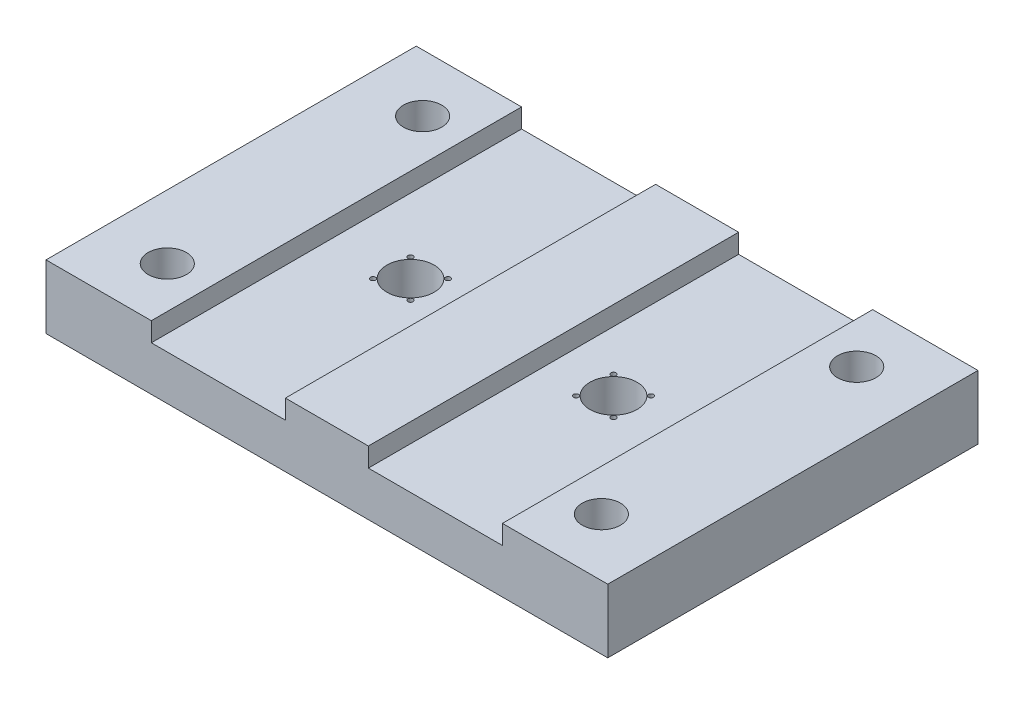
ISO-10303-21;
HEADER;
FILE_DESCRIPTION(('STEP AP214'),'2;1');
FILE_NAME('part.step','',(''),(''),'','','');
FILE_SCHEMA(('AUTOMOTIVE_DESIGN { 1 0 10303 214 1 1 1 1 }'));
ENDSEC;
DATA;
#1=APPLICATION_CONTEXT('core data for automotive mechanical design processes');
#2=APPLICATION_PROTOCOL_DEFINITION('international standard','automotive_design',2000,#1);
#3=PRODUCT_CONTEXT('',#1,'mechanical');
#4=PRODUCT('Part','Part','',(#3));
#5=PRODUCT_RELATED_PRODUCT_CATEGORY('part','',(#4));
#6=PRODUCT_DEFINITION_FORMATION('','',#4);
#7=PRODUCT_DEFINITION_CONTEXT('part definition',#1,'design');
#8=PRODUCT_DEFINITION('design','',#6,#7);
#9=PRODUCT_DEFINITION_SHAPE('','',#8);
#10=(LENGTH_UNIT() NAMED_UNIT(*) SI_UNIT(.MILLI.,.METRE.));
#11=(NAMED_UNIT(*) PLANE_ANGLE_UNIT() SI_UNIT($,.RADIAN.));
#12=(NAMED_UNIT(*) SI_UNIT($,.STERADIAN.) SOLID_ANGLE_UNIT());
#13=UNCERTAINTY_MEASURE_WITH_UNIT(LENGTH_MEASURE(1.E-05),#10,'distance_accuracy_value','');
#14=(GEOMETRIC_REPRESENTATION_CONTEXT(3) GLOBAL_UNCERTAINTY_ASSIGNED_CONTEXT((#13)) GLOBAL_UNIT_ASSIGNED_CONTEXT((#10,
#11,#12)) REPRESENTATION_CONTEXT('',''));
#15=CARTESIAN_POINT('',(0.,0.,0.));
#16=DIRECTION('',(0.,0.,1.));
#17=DIRECTION('',(1.,0.,0.));
#18=AXIS2_PLACEMENT_3D('',#15,#16,#17);
#19=CARTESIAN_POINT('',(340.,-171.,-200.));
#20=DIRECTION('',(0.,1.,0.));
#21=DIRECTION('',(0.,0.,1.));
#22=AXIS2_PLACEMENT_3D('',#19,#20,#21);
#23=CYLINDRICAL_SURFACE('',#22,30.);
#24=CARTESIAN_POINT('',(340.,100.,-200.));
#25=DIRECTION('',(0.,1.,0.));
#26=DIRECTION('',(0.,0.,1.));
#27=AXIS2_PLACEMENT_3D('',#24,#25,#26);
#28=CIRCLE('',#27,30.);
#29=CARTESIAN_POINT('',(340.,100.,-170.));
#30=VERTEX_POINT('',#29);
#31=EDGE_CURVE('E267',#30,#30,#28,.T.);
#32=ORIENTED_EDGE('',*,*,#31,.T.);
#33=EDGE_LOOP('',(#32));
#34=FACE_BOUND('',#33,.T.);
#35=CARTESIAN_POINT('',(340.,10.,-200.));
#36=DIRECTION('',(0.,-1.,0.));
#37=DIRECTION('',(0.,0.,-1.));
#38=AXIS2_PLACEMENT_3D('',#35,#36,#37);
#39=CIRCLE('',#38,30.);
#40=CARTESIAN_POINT('',(340.,10.,-230.));
#41=VERTEX_POINT('',#40);
#42=EDGE_CURVE('E233',#41,#41,#39,.F.);
#43=ORIENTED_EDGE('',*,*,#42,.F.);
#44=EDGE_LOOP('',(#43));
#45=FACE_BOUND('',#44,.T.);
#46=ADVANCED_FACE('F34',(#34,#45),#23,.F.);
#47=CARTESIAN_POINT('',(-340.,-171.,-200.));
#48=DIRECTION('',(0.,1.,0.));
#49=DIRECTION('',(0.,0.,1.));
#50=AXIS2_PLACEMENT_3D('',#47,#48,#49);
#51=CYLINDRICAL_SURFACE('',#50,30.);
#52=CARTESIAN_POINT('',(-340.,100.,-200.));
#53=DIRECTION('',(0.,1.,0.));
#54=DIRECTION('',(0.,0.,1.));
#55=AXIS2_PLACEMENT_3D('',#52,#53,#54);
#56=CIRCLE('',#55,30.);
#57=CARTESIAN_POINT('',(-340.,100.,-170.));
#58=VERTEX_POINT('',#57);
#59=EDGE_CURVE('E270',#58,#58,#56,.T.);
#60=ORIENTED_EDGE('',*,*,#59,.T.);
#61=EDGE_LOOP('',(#60));
#62=FACE_BOUND('',#61,.T.);
#63=CARTESIAN_POINT('',(-340.,10.,-200.));
#64=DIRECTION('',(0.,-1.,0.));
#65=DIRECTION('',(0.,0.,-1.));
#66=AXIS2_PLACEMENT_3D('',#63,#64,#65);
#67=CIRCLE('',#66,30.);
#68=CARTESIAN_POINT('',(-340.,10.,-230.));
#69=VERTEX_POINT('',#68);
#70=EDGE_CURVE('E229',#69,#69,#67,.F.);
#71=ORIENTED_EDGE('',*,*,#70,.F.);
#72=EDGE_LOOP('',(#71));
#73=FACE_BOUND('',#72,.T.);
#74=ADVANCED_FACE('F336',(#62,#73),#51,.F.);
#75=CARTESIAN_POINT('',(340.,-171.,200.));
#76=DIRECTION('',(0.,1.,0.));
#77=DIRECTION('',(0.,0.,1.));
#78=AXIS2_PLACEMENT_3D('',#75,#76,#77);
#79=CYLINDRICAL_SURFACE('',#78,30.);
#80=CARTESIAN_POINT('',(340.,100.,200.));
#81=DIRECTION('',(0.,1.,0.));
#82=DIRECTION('',(0.,0.,-1.));
#83=AXIS2_PLACEMENT_3D('',#80,#81,#82);
#84=CIRCLE('',#83,30.);
#85=CARTESIAN_POINT('',(340.,100.,170.));
#86=VERTEX_POINT('',#85);
#87=EDGE_CURVE('E264',#86,#86,#84,.T.);
#88=ORIENTED_EDGE('',*,*,#87,.T.);
#89=EDGE_LOOP('',(#88));
#90=FACE_BOUND('',#89,.T.);
#91=CARTESIAN_POINT('',(340.,10.,200.));
#92=DIRECTION('',(0.,-1.,0.));
#93=DIRECTION('',(0.,0.,-1.));
#94=AXIS2_PLACEMENT_3D('',#91,#92,#93);
#95=CIRCLE('',#94,30.);
#96=CARTESIAN_POINT('',(340.,10.,170.));
#97=VERTEX_POINT('',#96);
#98=EDGE_CURVE('E224',#97,#97,#95,.F.);
#99=ORIENTED_EDGE('',*,*,#98,.F.);
#100=EDGE_LOOP('',(#99));
#101=FACE_BOUND('',#100,.T.);
#102=ADVANCED_FACE('F342',(#90,#101),#79,.F.);
#103=CARTESIAN_POINT('',(-340.,-171.,200.));
#104=DIRECTION('',(0.,1.,0.));
#105=DIRECTION('',(0.,0.,1.));
#106=AXIS2_PLACEMENT_3D('',#103,#104,#105);
#107=CYLINDRICAL_SURFACE('',#106,30.);
#108=CARTESIAN_POINT('',(-340.,100.,200.));
#109=DIRECTION('',(0.,1.,0.));
#110=DIRECTION('',(0.,0.,-1.));
#111=AXIS2_PLACEMENT_3D('',#108,#109,#110);
#112=CIRCLE('',#111,30.);
#113=CARTESIAN_POINT('',(-340.,100.,170.));
#114=VERTEX_POINT('',#113);
#115=EDGE_CURVE('E222',#114,#114,#112,.T.);
#116=ORIENTED_EDGE('',*,*,#115,.T.);
#117=EDGE_LOOP('',(#116));
#118=FACE_BOUND('',#117,.T.);
#119=CARTESIAN_POINT('',(-340.,10.,200.));
#120=DIRECTION('',(0.,-1.,0.));
#121=DIRECTION('',(0.,0.,-1.));
#122=AXIS2_PLACEMENT_3D('',#119,#120,#121);
#123=CIRCLE('',#122,30.);
#124=CARTESIAN_POINT('',(-340.,10.,170.));
#125=VERTEX_POINT('',#124);
#126=EDGE_CURVE('E219',#125,#125,#123,.F.);
#127=ORIENTED_EDGE('',*,*,#126,.F.);
#128=EDGE_LOOP('',(#127));
#129=FACE_BOUND('',#128,.T.);
#130=ADVANCED_FACE('F332',(#118,#129),#107,.F.);
#131=CARTESIAN_POINT('',(0.,100.,0.));
#132=DIRECTION('',(0.,1.,0.));
#133=DIRECTION('',(0.,0.,1.));
#134=AXIS2_PLACEMENT_3D('',#131,#132,#133);
#135=PLANE('',#134);
#136=ORIENTED_EDGE('',*,*,#115,.F.);
#137=EDGE_LOOP('',(#136));
#138=FACE_BOUND('',#137,.T.);
#139=ORIENTED_EDGE('',*,*,#59,.F.);
#140=EDGE_LOOP('',(#139));
#141=FACE_BOUND('',#140,.T.);
#142=DIRECTION('',(0.,0.,1.));
#143=VECTOR('',#142,1.);
#144=CARTESIAN_POINT('',(-275.,100.,290.));
#145=LINE('',#144,#143);
#146=CARTESIAN_POINT('',(-275.,100.,-290.));
#147=VERTEX_POINT('',#146);
#148=CARTESIAN_POINT('',(-275.,100.,290.));
#149=VERTEX_POINT('',#148);
#150=EDGE_CURVE('E155',#147,#149,#145,.T.);
#151=ORIENTED_EDGE('',*,*,#150,.F.);
#152=DIRECTION('',(-1.,0.,0.));
#153=VECTOR('',#152,1.);
#154=CARTESIAN_POINT('',(-440.,100.,-290.));
#155=LINE('',#154,#153);
#156=CARTESIAN_POINT('',(-440.,100.,-290.));
#157=VERTEX_POINT('',#156);
#158=EDGE_CURVE('E160',#147,#157,#155,.T.);
#159=ORIENTED_EDGE('',*,*,#158,.T.);
#160=DIRECTION('',(0.,0.,1.));
#161=VECTOR('',#160,1.);
#162=CARTESIAN_POINT('',(-440.,100.,-290.));
#163=LINE('',#162,#161);
#164=CARTESIAN_POINT('',(-440.,100.,290.));
#165=VERTEX_POINT('',#164);
#166=EDGE_CURVE('E201',#157,#165,#163,.T.);
#167=ORIENTED_EDGE('',*,*,#166,.T.);
#168=DIRECTION('',(1.,0.,0.));
#169=VECTOR('',#168,1.);
#170=CARTESIAN_POINT('',(-440.,100.,290.));
#171=LINE('',#170,#169);
#172=EDGE_CURVE('E204',#165,#149,#171,.T.);
#173=ORIENTED_EDGE('',*,*,#172,.T.);
#174=EDGE_LOOP('',(#151,#159,#167,#173));
#175=FACE_BOUND('',#174,.T.);
#176=ADVANCED_FACE('F288',(#138,#141,#175),#135,.T.);
#177=DIRECTION('',(0.,0.,-1.));
#178=VECTOR('',#177,1.);
#179=CARTESIAN_POINT('',(-65.,100.,-290.));
#180=LINE('',#179,#178);
#181=CARTESIAN_POINT('',(-65.,100.,290.));
#182=VERTEX_POINT('',#181);
#183=CARTESIAN_POINT('',(-65.,100.,-290.));
#184=VERTEX_POINT('',#183);
#185=EDGE_CURVE('E173',#182,#184,#180,.T.);
#186=ORIENTED_EDGE('',*,*,#185,.F.);
#187=CARTESIAN_POINT('',(64.9999999999997,100.,290.));
#188=VERTEX_POINT('',#187);
#189=EDGE_CURVE('E208',#182,#188,#171,.T.);
#190=ORIENTED_EDGE('',*,*,#189,.T.);
#191=DIRECTION('',(0.,0.,1.));
#192=VECTOR('',#191,1.);
#193=CARTESIAN_POINT('',(64.9999999999998,100.,-290.));
#194=LINE('',#193,#192);
#195=CARTESIAN_POINT('',(64.9999999999998,100.,-290.));
#196=VERTEX_POINT('',#195);
#197=EDGE_CURVE('E181',#196,#188,#194,.T.);
#198=ORIENTED_EDGE('',*,*,#197,.F.);
#199=EDGE_CURVE('E202',#196,#184,#155,.T.);
#200=ORIENTED_EDGE('',*,*,#199,.T.);
#201=EDGE_LOOP('',(#186,#190,#198,#200));
#202=FACE_BOUND('',#201,.T.);
#203=ADVANCED_FACE('F303',(#202),#135,.T.);
#204=CARTESIAN_POINT('',(440.,100.,-290.));
#205=DIRECTION('',(-1.,0.,0.));
#206=DIRECTION('',(0.,0.,1.));
#207=AXIS2_PLACEMENT_3D('',#204,#205,#206);
#208=PLANE('',#207);
#209=DIRECTION('',(0.,0.,-1.));
#210=VECTOR('',#209,1.);
#211=CARTESIAN_POINT('',(440.,0.,-290.));
#212=LINE('',#211,#210);
#213=CARTESIAN_POINT('',(440.,0.,290.));
#214=VERTEX_POINT('',#213);
#215=CARTESIAN_POINT('',(440.,0.,-290.));
#216=VERTEX_POINT('',#215);
#217=EDGE_CURVE('E196',#214,#216,#212,.T.);
#218=ORIENTED_EDGE('',*,*,#217,.T.);
#219=DIRECTION('',(0.,-1.,0.));
#220=VECTOR('',#219,1.);
#221=CARTESIAN_POINT('',(440.,100.,-290.));
#222=LINE('',#221,#220);
#223=CARTESIAN_POINT('',(440.,100.,-290.));
#224=VERTEX_POINT('',#223);
#225=EDGE_CURVE('E11',#224,#216,#222,.T.);
#226=ORIENTED_EDGE('',*,*,#225,.F.);
#227=DIRECTION('',(0.,0.,-1.));
#228=VECTOR('',#227,1.);
#229=CARTESIAN_POINT('',(440.,100.,-290.));
#230=LINE('',#229,#228);
#231=CARTESIAN_POINT('',(440.,100.,290.));
#232=VERTEX_POINT('',#231);
#233=EDGE_CURVE('E198',#232,#224,#230,.T.);
#234=ORIENTED_EDGE('',*,*,#233,.F.);
#235=DIRECTION('',(0.,-1.,0.));
#236=VECTOR('',#235,1.);
#237=CARTESIAN_POINT('',(440.,100.,290.));
#238=LINE('',#237,#236);
#239=EDGE_CURVE('E207',#232,#214,#238,.T.);
#240=ORIENTED_EDGE('',*,*,#239,.T.);
#241=EDGE_LOOP('',(#218,#226,#234,#240));
#242=FACE_BOUND('',#241,.T.);
#243=ADVANCED_FACE('F36',(#242),#208,.F.);
#244=CARTESIAN_POINT('',(-440.,100.,-290.));
#245=DIRECTION('',(0.,0.,1.));
#246=DIRECTION('',(1.,0.,0.));
#247=AXIS2_PLACEMENT_3D('',#244,#245,#246);
#248=PLANE('',#247);
#249=ORIENTED_EDGE('',*,*,#158,.F.);
#250=DIRECTION('',(0.,1.,0.));
#251=VECTOR('',#250,1.);
#252=CARTESIAN_POINT('',(-275.,70.,-290.));
#253=LINE('',#252,#251);
#254=CARTESIAN_POINT('',(-275.,70.,-290.));
#255=VERTEX_POINT('',#254);
#256=EDGE_CURVE('E151',#255,#147,#253,.T.);
#257=ORIENTED_EDGE('',*,*,#256,.F.);
#258=DIRECTION('',(-1.,0.,0.));
#259=VECTOR('',#258,1.);
#260=CARTESIAN_POINT('',(-225.,70.,-290.));
#261=LINE('',#260,#259);
#262=CARTESIAN_POINT('',(-65.,70.,-290.));
#263=VERTEX_POINT('',#262);
#264=EDGE_CURVE('E138',#263,#255,#261,.T.);
#265=ORIENTED_EDGE('',*,*,#264,.F.);
#266=DIRECTION('',(0.,1.,0.));
#267=VECTOR('',#266,1.);
#268=CARTESIAN_POINT('',(-65.,70.,-290.));
#269=LINE('',#268,#267);
#270=EDGE_CURVE('E179',#263,#184,#269,.T.);
#271=ORIENTED_EDGE('',*,*,#270,.T.);
#272=ORIENTED_EDGE('',*,*,#199,.F.);
#273=DIRECTION('',(0.,1.,0.));
#274=VECTOR('',#273,1.);
#275=CARTESIAN_POINT('',(64.9999999999998,70.,-290.));
#276=LINE('',#275,#274);
#277=CARTESIAN_POINT('',(64.9999999999998,70.,-290.));
#278=VERTEX_POINT('',#277);
#279=EDGE_CURVE('E190',#278,#196,#276,.T.);
#280=ORIENTED_EDGE('',*,*,#279,.F.);
#281=DIRECTION('',(-1.,0.,0.));
#282=VECTOR('',#281,1.);
#283=CARTESIAN_POINT('',(64.9999999999998,70.,-290.));
#284=LINE('',#283,#282);
#285=CARTESIAN_POINT('',(275.,70.,-290.));
#286=VERTEX_POINT('',#285);
#287=EDGE_CURVE('E185',#286,#278,#284,.T.);
#288=ORIENTED_EDGE('',*,*,#287,.F.);
#289=DIRECTION('',(0.,1.,0.));
#290=VECTOR('',#289,1.);
#291=CARTESIAN_POINT('',(275.,70.,-290.));
#292=LINE('',#291,#290);
#293=CARTESIAN_POINT('',(275.,100.,-290.));
#294=VERTEX_POINT('',#293);
#295=EDGE_CURVE('E171',#286,#294,#292,.T.);
#296=ORIENTED_EDGE('',*,*,#295,.T.);
#297=EDGE_CURVE('E85',#224,#294,#155,.T.);
#298=ORIENTED_EDGE('',*,*,#297,.F.);
#299=ORIENTED_EDGE('',*,*,#225,.T.);
#300=DIRECTION('',(-1.,0.,0.));
#301=VECTOR('',#300,1.);
#302=CARTESIAN_POINT('',(-440.,0.,-290.));
#303=LINE('',#302,#301);
#304=CARTESIAN_POINT('',(-440.,0.,-290.));
#305=VERTEX_POINT('',#304);
#306=EDGE_CURVE('E211',#216,#305,#303,.T.);
#307=ORIENTED_EDGE('',*,*,#306,.T.);
#308=DIRECTION('',(0.,-1.,0.));
#309=VECTOR('',#308,1.);
#310=CARTESIAN_POINT('',(-440.,100.,-290.));
#311=LINE('',#310,#309);
#312=EDGE_CURVE('E44',#157,#305,#311,.T.);
#313=ORIENTED_EDGE('',*,*,#312,.F.);
#314=EDGE_LOOP('',(#249,#257,#265,#271,#272,#280,#288,#296,#298,#299,#307,#313));
#315=FACE_BOUND('',#314,.T.);
#316=ADVANCED_FACE('F158',(#315),#248,.F.);
#317=CARTESIAN_POINT('',(-440.,100.,-290.));
#318=DIRECTION('',(1.,0.,0.));
#319=DIRECTION('',(0.,0.,-1.));
#320=AXIS2_PLACEMENT_3D('',#317,#318,#319);
#321=PLANE('',#320);
#322=DIRECTION('',(0.,0.,1.));
#323=VECTOR('',#322,1.);
#324=CARTESIAN_POINT('',(-440.,0.,-290.));
#325=LINE('',#324,#323);
#326=CARTESIAN_POINT('',(-440.,0.,290.));
#327=VERTEX_POINT('',#326);
#328=EDGE_CURVE('E72',#305,#327,#325,.T.);
#329=ORIENTED_EDGE('',*,*,#328,.T.);
#330=DIRECTION('',(0.,-1.,0.));
#331=VECTOR('',#330,1.);
#332=CARTESIAN_POINT('',(-440.,100.,290.));
#333=LINE('',#332,#331);
#334=EDGE_CURVE('E216',#165,#327,#333,.T.);
#335=ORIENTED_EDGE('',*,*,#334,.F.);
#336=ORIENTED_EDGE('',*,*,#166,.F.);
#337=ORIENTED_EDGE('',*,*,#312,.T.);
#338=EDGE_LOOP('',(#329,#335,#336,#337));
#339=FACE_BOUND('',#338,.T.);
#340=ADVANCED_FACE('F290',(#339),#321,.F.);
#341=CARTESIAN_POINT('',(-440.,100.,290.));
#342=DIRECTION('',(0.,0.,-1.));
#343=DIRECTION('',(-1.,0.,0.));
#344=AXIS2_PLACEMENT_3D('',#341,#342,#343);
#345=PLANE('',#344);
#346=DIRECTION('',(1.,0.,0.));
#347=VECTOR('',#346,1.);
#348=CARTESIAN_POINT('',(-225.,70.,290.));
#349=LINE('',#348,#347);
#350=CARTESIAN_POINT('',(-275.,70.,290.));
#351=VERTEX_POINT('',#350);
#352=CARTESIAN_POINT('',(-65.,70.,290.));
#353=VERTEX_POINT('',#352);
#354=EDGE_CURVE('E175',#351,#353,#349,.T.);
#355=ORIENTED_EDGE('',*,*,#354,.F.);
#356=DIRECTION('',(0.,1.,0.));
#357=VECTOR('',#356,1.);
#358=CARTESIAN_POINT('',(-275.,70.,290.));
#359=LINE('',#358,#357);
#360=EDGE_CURVE('E154',#351,#149,#359,.T.);
#361=ORIENTED_EDGE('',*,*,#360,.T.);
#362=ORIENTED_EDGE('',*,*,#172,.F.);
#363=ORIENTED_EDGE('',*,*,#334,.T.);
#364=DIRECTION('',(1.,0.,0.));
#365=VECTOR('',#364,1.);
#366=CARTESIAN_POINT('',(-440.,0.,290.));
#367=LINE('',#366,#365);
#368=EDGE_CURVE('E78',#327,#214,#367,.T.);
#369=ORIENTED_EDGE('',*,*,#368,.T.);
#370=ORIENTED_EDGE('',*,*,#239,.F.);
#371=CARTESIAN_POINT('',(275.,100.,290.));
#372=VERTEX_POINT('',#371);
#373=EDGE_CURVE('E53',#372,#232,#171,.T.);
#374=ORIENTED_EDGE('',*,*,#373,.F.);
#375=DIRECTION('',(0.,1.,0.));
#376=VECTOR('',#375,1.);
#377=CARTESIAN_POINT('',(275.,70.,290.));
#378=LINE('',#377,#376);
#379=CARTESIAN_POINT('',(275.,70.,290.));
#380=VERTEX_POINT('',#379);
#381=EDGE_CURVE('E169',#380,#372,#378,.T.);
#382=ORIENTED_EDGE('',*,*,#381,.F.);
#383=DIRECTION('',(1.,0.,0.));
#384=VECTOR('',#383,1.);
#385=CARTESIAN_POINT('',(64.9999999999997,70.,290.));
#386=LINE('',#385,#384);
#387=CARTESIAN_POINT('',(64.9999999999997,70.,290.));
#388=VERTEX_POINT('',#387);
#389=EDGE_CURVE('E183',#388,#380,#386,.T.);
#390=ORIENTED_EDGE('',*,*,#389,.F.);
#391=DIRECTION('',(0.,1.,0.));
#392=VECTOR('',#391,1.);
#393=CARTESIAN_POINT('',(64.9999999999997,70.,290.));
#394=LINE('',#393,#392);
#395=EDGE_CURVE('E193',#388,#188,#394,.T.);
#396=ORIENTED_EDGE('',*,*,#395,.T.);
#397=ORIENTED_EDGE('',*,*,#189,.F.);
#398=DIRECTION('',(0.,1.,0.));
#399=VECTOR('',#398,1.);
#400=CARTESIAN_POINT('',(-65.,70.,290.));
#401=LINE('',#400,#399);
#402=EDGE_CURVE('E146',#353,#182,#401,.T.);
#403=ORIENTED_EDGE('',*,*,#402,.F.);
#404=EDGE_LOOP('',(#355,#361,#362,#363,#369,#370,#374,#382,#390,#396,#397,#403));
#405=FACE_BOUND('',#404,.T.);
#406=ADVANCED_FACE('F286',(#405),#345,.F.);
#407=ORIENTED_EDGE('',*,*,#87,.F.);
#408=EDGE_LOOP('',(#407));
#409=FACE_BOUND('',#408,.T.);
#410=ORIENTED_EDGE('',*,*,#31,.F.);
#411=EDGE_LOOP('',(#410));
#412=FACE_BOUND('',#411,.T.);
#413=DIRECTION('',(0.,0.,-1.));
#414=VECTOR('',#413,1.);
#415=CARTESIAN_POINT('',(275.,100.,-290.));
#416=LINE('',#415,#414);
#417=EDGE_CURVE('E162',#372,#294,#416,.T.);
#418=ORIENTED_EDGE('',*,*,#417,.F.);
#419=ORIENTED_EDGE('',*,*,#373,.T.);
#420=ORIENTED_EDGE('',*,*,#233,.T.);
#421=ORIENTED_EDGE('',*,*,#297,.T.);
#422=EDGE_LOOP('',(#418,#419,#420,#421));
#423=FACE_BOUND('',#422,.T.);
#424=ADVANCED_FACE('F316',(#409,#412,#423),#135,.T.);
#425=CARTESIAN_POINT('',(0.,0.,0.));
#426=DIRECTION('',(0.,1.,0.));
#427=DIRECTION('',(0.,0.,1.));
#428=AXIS2_PLACEMENT_3D('',#425,#426,#427);
#429=PLANE('',#428);
#430=CARTESIAN_POINT('',(188.344931419241,0.,29.344931419242));
#431=DIRECTION('',(0.,1.,0.));
#432=DIRECTION('',(-1.,0.,0.));
#433=AXIS2_PLACEMENT_3D('',#430,#431,#432);
#434=CIRCLE('',#433,3.99999999999999);
#435=CARTESIAN_POINT('',(184.344931419241,0.,29.3449314192419));
#436=VERTEX_POINT('',#435);
#437=EDGE_CURVE('E674',#436,#436,#434,.T.);
#438=ORIENTED_EDGE('',*,*,#437,.T.);
#439=EDGE_LOOP('',(#438));
#440=FACE_BOUND('',#439,.T.);
#441=CARTESIAN_POINT('',(188.344931419242,0.,-29.3449314192418));
#442=DIRECTION('',(0.,1.,0.));
#443=DIRECTION('',(0.,0.,1.));
#444=AXIS2_PLACEMENT_3D('',#441,#442,#443);
#445=CIRCLE('',#444,3.99999999999999);
#446=CARTESIAN_POINT('',(188.344931419242,0.,-25.3449314192418));
#447=VERTEX_POINT('',#446);
#448=EDGE_CURVE('E678',#447,#447,#445,.T.);
#449=ORIENTED_EDGE('',*,*,#448,.T.);
#450=EDGE_LOOP('',(#449));
#451=FACE_BOUND('',#450,.T.);
#452=CARTESIAN_POINT('',(129.655068580758,0.,-29.3449314192419));
#453=DIRECTION('',(0.,1.,0.));
#454=DIRECTION('',(1.,0.,0.));
#455=AXIS2_PLACEMENT_3D('',#452,#453,#454);
#456=CIRCLE('',#455,3.99999999999999);
#457=CARTESIAN_POINT('',(133.655068580758,0.,-29.3449314192419));
#458=VERTEX_POINT('',#457);
#459=EDGE_CURVE('E687',#458,#458,#456,.T.);
#460=ORIENTED_EDGE('',*,*,#459,.T.);
#461=EDGE_LOOP('',(#460));
#462=FACE_BOUND('',#461,.T.);
#463=CARTESIAN_POINT('',(129.655068580758,0.,29.3449314192417));
#464=DIRECTION('',(0.,1.,0.));
#465=DIRECTION('',(0.,0.,-1.));
#466=AXIS2_PLACEMENT_3D('',#463,#464,#465);
#467=CIRCLE('',#466,3.99999999999999);
#468=CARTESIAN_POINT('',(129.655068580758,0.,25.3449314192417));
#469=VERTEX_POINT('',#468);
#470=EDGE_CURVE('E693',#469,#469,#467,.T.);
#471=ORIENTED_EDGE('',*,*,#470,.T.);
#472=EDGE_LOOP('',(#471));
#473=FACE_BOUND('',#472,.T.);
#474=CARTESIAN_POINT('',(-188.344931419241,0.,29.344931419242));
#475=DIRECTION('',(0.,-1.,0.));
#476=DIRECTION('',(1.,0.,0.));
#477=AXIS2_PLACEMENT_3D('',#474,#475,#476);
#478=CIRCLE('',#477,3.99999999999999);
#479=CARTESIAN_POINT('',(-184.344931419241,0.,29.3449314192419));
#480=VERTEX_POINT('',#479);
#481=EDGE_CURVE('E699',#480,#480,#478,.T.);
#482=ORIENTED_EDGE('',*,*,#481,.F.);
#483=EDGE_LOOP('',(#482));
#484=FACE_BOUND('',#483,.T.);
#485=CARTESIAN_POINT('',(-188.344931419242,0.,-29.3449314192418));
#486=DIRECTION('',(0.,-1.,0.));
#487=DIRECTION('',(0.,0.,1.));
#488=AXIS2_PLACEMENT_3D('',#485,#486,#487);
#489=CIRCLE('',#488,3.99999999999999);
#490=CARTESIAN_POINT('',(-188.344931419242,0.,-25.3449314192418));
#491=VERTEX_POINT('',#490);
#492=EDGE_CURVE('E705',#491,#491,#489,.T.);
#493=ORIENTED_EDGE('',*,*,#492,.F.);
#494=EDGE_LOOP('',(#493));
#495=FACE_BOUND('',#494,.T.);
#496=CARTESIAN_POINT('',(-129.655068580758,0.,-29.3449314192419));
#497=DIRECTION('',(0.,-1.,0.));
#498=DIRECTION('',(-1.,0.,0.));
#499=AXIS2_PLACEMENT_3D('',#496,#497,#498);
#500=CIRCLE('',#499,3.99999999999999);
#501=CARTESIAN_POINT('',(-133.655068580758,0.,-29.3449314192419));
#502=VERTEX_POINT('',#501);
#503=EDGE_CURVE('E710',#502,#502,#500,.T.);
#504=ORIENTED_EDGE('',*,*,#503,.F.);
#505=EDGE_LOOP('',(#504));
#506=FACE_BOUND('',#505,.T.);
#507=CARTESIAN_POINT('',(-129.655068580758,0.,29.3449314192417));
#508=DIRECTION('',(0.,-1.,0.));
#509=DIRECTION('',(0.,0.,-1.));
#510=AXIS2_PLACEMENT_3D('',#507,#508,#509);
#511=CIRCLE('',#510,3.99999999999999);
#512=CARTESIAN_POINT('',(-129.655068580758,0.,25.3449314192417));
#513=VERTEX_POINT('',#512);
#514=EDGE_CURVE('E249',#513,#513,#511,.T.);
#515=ORIENTED_EDGE('',*,*,#514,.F.);
#516=EDGE_LOOP('',(#515));
#517=FACE_BOUND('',#516,.T.);
#518=CARTESIAN_POINT('',(340.,0.,-200.));
#519=DIRECTION('',(0.,-1.,0.));
#520=DIRECTION('',(0.,0.,-1.));
#521=AXIS2_PLACEMENT_3D('',#518,#519,#520);
#522=CIRCLE('',#521,35.);
#523=CARTESIAN_POINT('',(340.,0.,-235.));
#524=VERTEX_POINT('',#523);
#525=EDGE_CURVE('E242',#524,#524,#522,.T.);
#526=ORIENTED_EDGE('',*,*,#525,.F.);
#527=EDGE_LOOP('',(#526));
#528=FACE_BOUND('',#527,.T.);
#529=CARTESIAN_POINT('',(-340.,0.,-200.));
#530=DIRECTION('',(0.,-1.,0.));
#531=DIRECTION('',(0.,0.,-1.));
#532=AXIS2_PLACEMENT_3D('',#529,#530,#531);
#533=CIRCLE('',#532,35.);
#534=CARTESIAN_POINT('',(-340.,0.,-235.));
#535=VERTEX_POINT('',#534);
#536=EDGE_CURVE('E235',#535,#535,#533,.T.);
#537=ORIENTED_EDGE('',*,*,#536,.F.);
#538=EDGE_LOOP('',(#537));
#539=FACE_BOUND('',#538,.T.);
#540=CARTESIAN_POINT('',(340.,0.,200.));
#541=DIRECTION('',(0.,-1.,0.));
#542=DIRECTION('',(0.,0.,-1.));
#543=AXIS2_PLACEMENT_3D('',#540,#541,#542);
#544=CIRCLE('',#543,35.);
#545=CARTESIAN_POINT('',(340.,0.,165.));
#546=VERTEX_POINT('',#545);
#547=EDGE_CURVE('E231',#546,#546,#544,.T.);
#548=ORIENTED_EDGE('',*,*,#547,.F.);
#549=EDGE_LOOP('',(#548));
#550=FACE_BOUND('',#549,.T.);
#551=CARTESIAN_POINT('',(-340.,0.,200.));
#552=DIRECTION('',(0.,-1.,0.));
#553=DIRECTION('',(0.,0.,-1.));
#554=AXIS2_PLACEMENT_3D('',#551,#552,#553);
#555=CIRCLE('',#554,35.);
#556=CARTESIAN_POINT('',(-340.,0.,165.));
#557=VERTEX_POINT('',#556);
#558=EDGE_CURVE('E227',#557,#557,#555,.T.);
#559=ORIENTED_EDGE('',*,*,#558,.F.);
#560=EDGE_LOOP('',(#559));
#561=FACE_BOUND('',#560,.T.);
#562=CARTESIAN_POINT('',(159.,0.,0.));
#563=DIRECTION('',(0.,1.,0.));
#564=DIRECTION('',(0.,0.,1.));
#565=AXIS2_PLACEMENT_3D('',#562,#563,#564);
#566=CIRCLE('',#565,37.);
#567=CARTESIAN_POINT('',(159.,0.,37.));
#568=VERTEX_POINT('',#567);
#569=EDGE_CURVE('E276',#568,#568,#566,.T.);
#570=ORIENTED_EDGE('',*,*,#569,.T.);
#571=EDGE_LOOP('',(#570));
#572=FACE_BOUND('',#571,.T.);
#573=CARTESIAN_POINT('',(-159.,0.,0.));
#574=DIRECTION('',(0.,1.,0.));
#575=DIRECTION('',(0.,0.,1.));
#576=AXIS2_PLACEMENT_3D('',#573,#574,#575);
#577=CIRCLE('',#576,37.);
#578=CARTESIAN_POINT('',(-159.,0.,37.));
#579=VERTEX_POINT('',#578);
#580=EDGE_CURVE('E282',#579,#579,#577,.T.);
#581=ORIENTED_EDGE('',*,*,#580,.T.);
#582=EDGE_LOOP('',(#581));
#583=FACE_BOUND('',#582,.T.);
#584=ORIENTED_EDGE('',*,*,#217,.F.);
#585=ORIENTED_EDGE('',*,*,#368,.F.);
#586=ORIENTED_EDGE('',*,*,#328,.F.);
#587=ORIENTED_EDGE('',*,*,#306,.F.);
#588=EDGE_LOOP('',(#584,#585,#586,#587));
#589=FACE_BOUND('',#588,.T.);
#590=ADVANCED_FACE('F293',(#440,#451,#462,#473,#484,#495,#506,#517,#528,#539,#550,#561,#572,
#583,#589),#429,.F.);
#591=CARTESIAN_POINT('',(64.9999999999998,70.,-290.));
#592=DIRECTION('',(-1.,0.,0.));
#593=DIRECTION('',(0.,0.,1.));
#594=AXIS2_PLACEMENT_3D('',#591,#592,#593);
#595=PLANE('',#594);
#596=ORIENTED_EDGE('',*,*,#197,.T.);
#597=ORIENTED_EDGE('',*,*,#395,.F.);
#598=DIRECTION('',(0.,0.,1.));
#599=VECTOR('',#598,1.);
#600=CARTESIAN_POINT('',(64.9999999999998,70.,-290.));
#601=LINE('',#600,#599);
#602=EDGE_CURVE('E187',#278,#388,#601,.T.);
#603=ORIENTED_EDGE('',*,*,#602,.F.);
#604=ORIENTED_EDGE('',*,*,#279,.T.);
#605=EDGE_LOOP('',(#596,#597,#603,#604));
#606=FACE_BOUND('',#605,.T.);
#607=ADVANCED_FACE('F307',(#606),#595,.F.);
#608=CARTESIAN_POINT('',(0.,70.,0.));
#609=DIRECTION('',(0.,-1.,0.));
#610=DIRECTION('',(0.,0.,-1.));
#611=AXIS2_PLACEMENT_3D('',#608,#609,#610);
#612=PLANE('',#611);
#613=CARTESIAN_POINT('',(188.344931419241,70.,29.344931419242));
#614=DIRECTION('',(0.,-1.,0.));
#615=DIRECTION('',(1.,0.,0.));
#616=AXIS2_PLACEMENT_3D('',#613,#614,#615);
#617=CIRCLE('',#616,3.99999999999999);
#618=CARTESIAN_POINT('',(192.344931419241,70.,29.344931419242));
#619=VERTEX_POINT('',#618);
#620=EDGE_CURVE('E671',#619,#619,#617,.T.);
#621=ORIENTED_EDGE('',*,*,#620,.T.);
#622=EDGE_LOOP('',(#621));
#623=FACE_BOUND('',#622,.T.);
#624=CARTESIAN_POINT('',(188.344931419242,70.,-29.3449314192418));
#625=DIRECTION('',(0.,-1.,0.));
#626=DIRECTION('',(0.,0.,-1.));
#627=AXIS2_PLACEMENT_3D('',#624,#625,#626);
#628=CIRCLE('',#627,3.99999999999999);
#629=CARTESIAN_POINT('',(188.344931419242,70.,-33.3449314192418));
#630=VERTEX_POINT('',#629);
#631=EDGE_CURVE('E675',#630,#630,#628,.T.);
#632=ORIENTED_EDGE('',*,*,#631,.T.);
#633=EDGE_LOOP('',(#632));
#634=FACE_BOUND('',#633,.T.);
#635=CARTESIAN_POINT('',(129.655068580758,70.,-29.3449314192419));
#636=DIRECTION('',(0.,-1.,0.));
#637=DIRECTION('',(-1.,0.,0.));
#638=AXIS2_PLACEMENT_3D('',#635,#636,#637);
#639=CIRCLE('',#638,3.99999999999999);
#640=CARTESIAN_POINT('',(125.655068580758,70.,-29.3449314192419));
#641=VERTEX_POINT('',#640);
#642=EDGE_CURVE('E684',#641,#641,#639,.T.);
#643=ORIENTED_EDGE('',*,*,#642,.T.);
#644=EDGE_LOOP('',(#643));
#645=FACE_BOUND('',#644,.T.);
#646=CARTESIAN_POINT('',(129.655068580758,70.,29.3449314192417));
#647=DIRECTION('',(0.,-1.,0.));
#648=DIRECTION('',(0.,0.,1.));
#649=AXIS2_PLACEMENT_3D('',#646,#647,#648);
#650=CIRCLE('',#649,3.99999999999999);
#651=CARTESIAN_POINT('',(129.655068580758,70.,33.3449314192417));
#652=VERTEX_POINT('',#651);
#653=EDGE_CURVE('E690',#652,#652,#650,.T.);
#654=ORIENTED_EDGE('',*,*,#653,.T.);
#655=EDGE_LOOP('',(#654));
#656=FACE_BOUND('',#655,.T.);
#657=CARTESIAN_POINT('',(159.,70.,0.));
#658=DIRECTION('',(0.,1.,0.));
#659=DIRECTION('',(0.,0.,1.));
#660=AXIS2_PLACEMENT_3D('',#657,#658,#659);
#661=CIRCLE('',#660,37.);
#662=CARTESIAN_POINT('',(159.,70.,37.));
#663=VERTEX_POINT('',#662);
#664=EDGE_CURVE('E273',#663,#663,#661,.T.);
#665=ORIENTED_EDGE('',*,*,#664,.F.);
#666=EDGE_LOOP('',(#665));
#667=FACE_BOUND('',#666,.T.);
#668=ORIENTED_EDGE('',*,*,#389,.T.);
#669=DIRECTION('',(0.,0.,-1.));
#670=VECTOR('',#669,1.);
#671=CARTESIAN_POINT('',(275.,70.,-290.));
#672=LINE('',#671,#670);
#673=EDGE_CURVE('E166',#380,#286,#672,.T.);
#674=ORIENTED_EDGE('',*,*,#673,.T.);
#675=ORIENTED_EDGE('',*,*,#287,.T.);
#676=ORIENTED_EDGE('',*,*,#602,.T.);
#677=EDGE_LOOP('',(#668,#674,#675,#676));
#678=FACE_BOUND('',#677,.T.);
#679=ADVANCED_FACE('F312',(#623,#634,#645,#656,#667,#678),#612,.F.);
#680=CARTESIAN_POINT('',(-65.,70.,-290.));
#681=DIRECTION('',(1.,0.,0.));
#682=DIRECTION('',(0.,0.,-1.));
#683=AXIS2_PLACEMENT_3D('',#680,#681,#682);
#684=PLANE('',#683);
#685=ORIENTED_EDGE('',*,*,#185,.T.);
#686=ORIENTED_EDGE('',*,*,#270,.F.);
#687=DIRECTION('',(0.,0.,-1.));
#688=VECTOR('',#687,1.);
#689=CARTESIAN_POINT('',(-65.,70.,-290.));
#690=LINE('',#689,#688);
#691=EDGE_CURVE('E143',#353,#263,#690,.T.);
#692=ORIENTED_EDGE('',*,*,#691,.F.);
#693=ORIENTED_EDGE('',*,*,#402,.T.);
#694=EDGE_LOOP('',(#685,#686,#692,#693));
#695=FACE_BOUND('',#694,.T.);
#696=ADVANCED_FACE('F363',(#695),#684,.F.);
#697=CARTESIAN_POINT('',(0.,70.,0.));
#698=DIRECTION('',(0.,1.,0.));
#699=DIRECTION('',(0.,0.,1.));
#700=AXIS2_PLACEMENT_3D('',#697,#698,#699);
#701=PLANE('',#700);
#702=CARTESIAN_POINT('',(-188.344931419241,70.,29.344931419242));
#703=DIRECTION('',(0.,1.,0.));
#704=DIRECTION('',(-1.,0.,0.));
#705=AXIS2_PLACEMENT_3D('',#702,#703,#704);
#706=CIRCLE('',#705,3.99999999999999);
#707=CARTESIAN_POINT('',(-192.344931419241,70.,29.344931419242));
#708=VERTEX_POINT('',#707);
#709=EDGE_CURVE('E696',#708,#708,#706,.T.);
#710=ORIENTED_EDGE('',*,*,#709,.F.);
#711=EDGE_LOOP('',(#710));
#712=FACE_BOUND('',#711,.T.);
#713=CARTESIAN_POINT('',(-188.344931419242,70.,-29.3449314192418));
#714=DIRECTION('',(0.,1.,0.));
#715=DIRECTION('',(0.,0.,-1.));
#716=AXIS2_PLACEMENT_3D('',#713,#714,#715);
#717=CIRCLE('',#716,3.99999999999999);
#718=CARTESIAN_POINT('',(-188.344931419242,70.,-33.3449314192418));
#719=VERTEX_POINT('',#718);
#720=EDGE_CURVE('E702',#719,#719,#717,.T.);
#721=ORIENTED_EDGE('',*,*,#720,.F.);
#722=EDGE_LOOP('',(#721));
#723=FACE_BOUND('',#722,.T.);
#724=CARTESIAN_POINT('',(-129.655068580758,70.,-29.3449314192419));
#725=DIRECTION('',(0.,1.,0.));
#726=DIRECTION('',(1.,0.,0.));
#727=AXIS2_PLACEMENT_3D('',#724,#725,#726);
#728=CIRCLE('',#727,3.99999999999999);
#729=CARTESIAN_POINT('',(-125.655068580758,70.,-29.3449314192419));
#730=VERTEX_POINT('',#729);
#731=EDGE_CURVE('E708',#730,#730,#728,.T.);
#732=ORIENTED_EDGE('',*,*,#731,.F.);
#733=EDGE_LOOP('',(#732));
#734=FACE_BOUND('',#733,.T.);
#735=CARTESIAN_POINT('',(-129.655068580758,70.,29.3449314192417));
#736=DIRECTION('',(0.,1.,0.));
#737=DIRECTION('',(0.,0.,1.));
#738=AXIS2_PLACEMENT_3D('',#735,#736,#737);
#739=CIRCLE('',#738,3.99999999999999);
#740=CARTESIAN_POINT('',(-129.655068580758,70.,33.3449314192417));
#741=VERTEX_POINT('',#740);
#742=EDGE_CURVE('E38',#741,#741,#739,.T.);
#743=ORIENTED_EDGE('',*,*,#742,.F.);
#744=EDGE_LOOP('',(#743));
#745=FACE_BOUND('',#744,.T.);
#746=CARTESIAN_POINT('',(-159.,70.,0.));
#747=DIRECTION('',(0.,1.,0.));
#748=DIRECTION('',(0.,0.,1.));
#749=AXIS2_PLACEMENT_3D('',#746,#747,#748);
#750=CIRCLE('',#749,37.);
#751=CARTESIAN_POINT('',(-159.,70.,37.));
#752=VERTEX_POINT('',#751);
#753=EDGE_CURVE('E279',#752,#752,#750,.T.);
#754=ORIENTED_EDGE('',*,*,#753,.F.);
#755=EDGE_LOOP('',(#754));
#756=FACE_BOUND('',#755,.T.);
#757=ORIENTED_EDGE('',*,*,#264,.T.);
#758=DIRECTION('',(0.,0.,1.));
#759=VECTOR('',#758,1.);
#760=CARTESIAN_POINT('',(-275.,70.,290.));
#761=LINE('',#760,#759);
#762=EDGE_CURVE('E142',#255,#351,#761,.T.);
#763=ORIENTED_EDGE('',*,*,#762,.T.);
#764=ORIENTED_EDGE('',*,*,#354,.T.);
#765=ORIENTED_EDGE('',*,*,#691,.T.);
#766=EDGE_LOOP('',(#757,#763,#764,#765));
#767=FACE_BOUND('',#766,.T.);
#768=ADVANCED_FACE('F140',(#712,#723,#734,#745,#756,#767),#701,.T.);
#769=CARTESIAN_POINT('',(275.,70.,-290.));
#770=DIRECTION('',(1.,0.,0.));
#771=DIRECTION('',(0.,0.,-1.));
#772=AXIS2_PLACEMENT_3D('',#769,#770,#771);
#773=PLANE('',#772);
#774=ORIENTED_EDGE('',*,*,#417,.T.);
#775=ORIENTED_EDGE('',*,*,#295,.F.);
#776=ORIENTED_EDGE('',*,*,#673,.F.);
#777=ORIENTED_EDGE('',*,*,#381,.T.);
#778=EDGE_LOOP('',(#774,#775,#776,#777));
#779=FACE_BOUND('',#778,.T.);
#780=ADVANCED_FACE('F315',(#779),#773,.F.);
#781=CARTESIAN_POINT('',(-275.,70.,290.));
#782=DIRECTION('',(-1.,0.,0.));
#783=DIRECTION('',(0.,0.,1.));
#784=AXIS2_PLACEMENT_3D('',#781,#782,#783);
#785=PLANE('',#784);
#786=ORIENTED_EDGE('',*,*,#150,.T.);
#787=ORIENTED_EDGE('',*,*,#360,.F.);
#788=ORIENTED_EDGE('',*,*,#762,.F.);
#789=ORIENTED_EDGE('',*,*,#256,.T.);
#790=EDGE_LOOP('',(#786,#787,#788,#789));
#791=FACE_BOUND('',#790,.T.);
#792=ADVANCED_FACE('F150',(#791),#785,.F.);
#793=CARTESIAN_POINT('',(-159.,-194.,0.));
#794=DIRECTION('',(0.,1.,0.));
#795=DIRECTION('',(0.,0.,1.));
#796=AXIS2_PLACEMENT_3D('',#793,#794,#795);
#797=CYLINDRICAL_SURFACE('',#796,37.);
#798=ORIENTED_EDGE('',*,*,#753,.T.);
#799=EDGE_LOOP('',(#798));
#800=FACE_BOUND('',#799,.T.);
#801=ORIENTED_EDGE('',*,*,#580,.F.);
#802=EDGE_LOOP('',(#801));
#803=FACE_BOUND('',#802,.T.);
#804=ADVANCED_FACE('F353',(#800,#803),#797,.F.);
#805=CARTESIAN_POINT('',(159.,-194.,0.));
#806=DIRECTION('',(0.,1.,0.));
#807=DIRECTION('',(0.,0.,1.));
#808=AXIS2_PLACEMENT_3D('',#805,#806,#807);
#809=CYLINDRICAL_SURFACE('',#808,37.);
#810=ORIENTED_EDGE('',*,*,#664,.T.);
#811=EDGE_LOOP('',(#810));
#812=FACE_BOUND('',#811,.T.);
#813=ORIENTED_EDGE('',*,*,#569,.F.);
#814=EDGE_LOOP('',(#813));
#815=FACE_BOUND('',#814,.T.);
#816=ADVANCED_FACE('F349',(#812,#815),#809,.F.);
#817=CARTESIAN_POINT('',(-340.,10.,200.));
#818=DIRECTION('',(0.,-1.,0.));
#819=DIRECTION('',(0.,0.,-1.));
#820=AXIS2_PLACEMENT_3D('',#817,#818,#819);
#821=PLANE('',#820);
#822=CARTESIAN_POINT('',(-340.,10.,200.));
#823=DIRECTION('',(0.,-1.,0.));
#824=DIRECTION('',(0.,0.,-1.));
#825=AXIS2_PLACEMENT_3D('',#822,#823,#824);
#826=CIRCLE('',#825,35.);
#827=CARTESIAN_POINT('',(-340.,10.,165.));
#828=VERTEX_POINT('',#827);
#829=EDGE_CURVE('E223',#828,#828,#826,.T.);
#830=ORIENTED_EDGE('',*,*,#829,.T.);
#831=EDGE_LOOP('',(#830));
#832=FACE_BOUND('',#831,.T.);
#833=ORIENTED_EDGE('',*,*,#126,.T.);
#834=EDGE_LOOP('',(#833));
#835=FACE_BOUND('',#834,.T.);
#836=ADVANCED_FACE('F352',(#832,#835),#821,.T.);
#837=CARTESIAN_POINT('',(-340.,10.,200.));
#838=DIRECTION('',(0.,-1.,0.));
#839=DIRECTION('',(0.,0.,-1.));
#840=AXIS2_PLACEMENT_3D('',#837,#838,#839);
#841=CYLINDRICAL_SURFACE('',#840,35.);
#842=ORIENTED_EDGE('',*,*,#829,.F.);
#843=EDGE_LOOP('',(#842));
#844=FACE_BOUND('',#843,.T.);
#845=ORIENTED_EDGE('',*,*,#558,.T.);
#846=EDGE_LOOP('',(#845));
#847=FACE_BOUND('',#846,.T.);
#848=ADVANCED_FACE('F481',(#844,#847),#841,.F.);
#849=CARTESIAN_POINT('',(340.,10.,200.));
#850=DIRECTION('',(0.,-1.,0.));
#851=DIRECTION('',(0.,0.,-1.));
#852=AXIS2_PLACEMENT_3D('',#849,#850,#851);
#853=PLANE('',#852);
#854=CARTESIAN_POINT('',(340.,10.,200.));
#855=DIRECTION('',(0.,-1.,0.));
#856=DIRECTION('',(0.,0.,-1.));
#857=AXIS2_PLACEMENT_3D('',#854,#855,#856);
#858=CIRCLE('',#857,35.);
#859=CARTESIAN_POINT('',(340.,10.,165.));
#860=VERTEX_POINT('',#859);
#861=EDGE_CURVE('E228',#860,#860,#858,.T.);
#862=ORIENTED_EDGE('',*,*,#861,.T.);
#863=EDGE_LOOP('',(#862));
#864=FACE_BOUND('',#863,.T.);
#865=ORIENTED_EDGE('',*,*,#98,.T.);
#866=EDGE_LOOP('',(#865));
#867=FACE_BOUND('',#866,.T.);
#868=ADVANCED_FACE('F490',(#864,#867),#853,.T.);
#869=CARTESIAN_POINT('',(340.,10.,200.));
#870=DIRECTION('',(0.,-1.,0.));
#871=DIRECTION('',(0.,0.,-1.));
#872=AXIS2_PLACEMENT_3D('',#869,#870,#871);
#873=CYLINDRICAL_SURFACE('',#872,35.);
#874=ORIENTED_EDGE('',*,*,#861,.F.);
#875=EDGE_LOOP('',(#874));
#876=FACE_BOUND('',#875,.T.);
#877=ORIENTED_EDGE('',*,*,#547,.T.);
#878=EDGE_LOOP('',(#877));
#879=FACE_BOUND('',#878,.T.);
#880=ADVANCED_FACE('F498',(#876,#879),#873,.F.);
#881=CARTESIAN_POINT('',(-340.,10.,-200.));
#882=DIRECTION('',(0.,-1.,0.));
#883=DIRECTION('',(0.,0.,-1.));
#884=AXIS2_PLACEMENT_3D('',#881,#882,#883);
#885=PLANE('',#884);
#886=CARTESIAN_POINT('',(-340.,10.,-200.));
#887=DIRECTION('',(0.,-1.,0.));
#888=DIRECTION('',(0.,0.,-1.));
#889=AXIS2_PLACEMENT_3D('',#886,#887,#888);
#890=CIRCLE('',#889,35.);
#891=CARTESIAN_POINT('',(-340.,10.,-235.));
#892=VERTEX_POINT('',#891);
#893=EDGE_CURVE('E232',#892,#892,#890,.T.);
#894=ORIENTED_EDGE('',*,*,#893,.T.);
#895=EDGE_LOOP('',(#894));
#896=FACE_BOUND('',#895,.T.);
#897=ORIENTED_EDGE('',*,*,#70,.T.);
#898=EDGE_LOOP('',(#897));
#899=FACE_BOUND('',#898,.T.);
#900=ADVANCED_FACE('F506',(#896,#899),#885,.T.);
#901=CARTESIAN_POINT('',(-340.,10.,-200.));
#902=DIRECTION('',(0.,-1.,0.));
#903=DIRECTION('',(0.,0.,-1.));
#904=AXIS2_PLACEMENT_3D('',#901,#902,#903);
#905=CYLINDRICAL_SURFACE('',#904,35.);
#906=ORIENTED_EDGE('',*,*,#893,.F.);
#907=EDGE_LOOP('',(#906));
#908=FACE_BOUND('',#907,.T.);
#909=ORIENTED_EDGE('',*,*,#536,.T.);
#910=EDGE_LOOP('',(#909));
#911=FACE_BOUND('',#910,.T.);
#912=ADVANCED_FACE('F514',(#908,#911),#905,.F.);
#913=CARTESIAN_POINT('',(340.,10.,-200.));
#914=DIRECTION('',(0.,-1.,0.));
#915=DIRECTION('',(0.,0.,-1.));
#916=AXIS2_PLACEMENT_3D('',#913,#914,#915);
#917=PLANE('',#916);
#918=CARTESIAN_POINT('',(340.,10.,-200.));
#919=DIRECTION('',(0.,-1.,0.));
#920=DIRECTION('',(0.,0.,-1.));
#921=AXIS2_PLACEMENT_3D('',#918,#919,#920);
#922=CIRCLE('',#921,35.);
#923=CARTESIAN_POINT('',(340.,10.,-235.));
#924=VERTEX_POINT('',#923);
#925=EDGE_CURVE('E236',#924,#924,#922,.T.);
#926=ORIENTED_EDGE('',*,*,#925,.T.);
#927=EDGE_LOOP('',(#926));
#928=FACE_BOUND('',#927,.T.);
#929=ORIENTED_EDGE('',*,*,#42,.T.);
#930=EDGE_LOOP('',(#929));
#931=FACE_BOUND('',#930,.T.);
#932=ADVANCED_FACE('F522',(#928,#931),#917,.T.);
#933=CARTESIAN_POINT('',(340.,10.,-200.));
#934=DIRECTION('',(0.,-1.,0.));
#935=DIRECTION('',(0.,0.,-1.));
#936=AXIS2_PLACEMENT_3D('',#933,#934,#935);
#937=CYLINDRICAL_SURFACE('',#936,35.);
#938=ORIENTED_EDGE('',*,*,#925,.F.);
#939=EDGE_LOOP('',(#938));
#940=FACE_BOUND('',#939,.T.);
#941=ORIENTED_EDGE('',*,*,#525,.T.);
#942=EDGE_LOOP('',(#941));
#943=FACE_BOUND('',#942,.T.);
#944=ADVANCED_FACE('F530',(#940,#943),#937,.F.);
#945=CARTESIAN_POINT('',(-129.655068580758,500.,29.3449314192417));
#946=DIRECTION('',(0.,-1.,0.));
#947=DIRECTION('',(0.,0.,-1.));
#948=AXIS2_PLACEMENT_3D('',#945,#946,#947);
#949=CYLINDRICAL_SURFACE('',#948,3.99999999999999);
#950=ORIENTED_EDGE('',*,*,#742,.T.);
#951=EDGE_LOOP('',(#950));
#952=FACE_BOUND('',#951,.T.);
#953=ORIENTED_EDGE('',*,*,#514,.T.);
#954=EDGE_LOOP('',(#953));
#955=FACE_BOUND('',#954,.T.);
#956=ADVANCED_FACE('F537',(#952,#955),#949,.F.);
#957=CARTESIAN_POINT('',(-129.655068580758,500.,-29.3449314192419));
#958=DIRECTION('',(0.,-1.,0.));
#959=DIRECTION('',(-1.,0.,0.));
#960=AXIS2_PLACEMENT_3D('',#957,#958,#959);
#961=CYLINDRICAL_SURFACE('',#960,3.99999999999999);
#962=ORIENTED_EDGE('',*,*,#731,.T.);
#963=EDGE_LOOP('',(#962));
#964=FACE_BOUND('',#963,.T.);
#965=ORIENTED_EDGE('',*,*,#503,.T.);
#966=EDGE_LOOP('',(#965));
#967=FACE_BOUND('',#966,.T.);
#968=ADVANCED_FACE('F544',(#964,#967),#961,.F.);
#969=CARTESIAN_POINT('',(-188.344931419242,500.,-29.3449314192418));
#970=DIRECTION('',(0.,-1.,0.));
#971=DIRECTION('',(0.,0.,1.));
#972=AXIS2_PLACEMENT_3D('',#969,#970,#971);
#973=CYLINDRICAL_SURFACE('',#972,3.99999999999999);
#974=ORIENTED_EDGE('',*,*,#720,.T.);
#975=EDGE_LOOP('',(#974));
#976=FACE_BOUND('',#975,.T.);
#977=ORIENTED_EDGE('',*,*,#492,.T.);
#978=EDGE_LOOP('',(#977));
#979=FACE_BOUND('',#978,.T.);
#980=ADVANCED_FACE('F551',(#976,#979),#973,.F.);
#981=CARTESIAN_POINT('',(-188.344931419241,500.,29.344931419242));
#982=DIRECTION('',(0.,-1.,0.));
#983=DIRECTION('',(1.,0.,0.));
#984=AXIS2_PLACEMENT_3D('',#981,#982,#983);
#985=CYLINDRICAL_SURFACE('',#984,3.99999999999999);
#986=ORIENTED_EDGE('',*,*,#709,.T.);
#987=EDGE_LOOP('',(#986));
#988=FACE_BOUND('',#987,.T.);
#989=ORIENTED_EDGE('',*,*,#481,.T.);
#990=EDGE_LOOP('',(#989));
#991=FACE_BOUND('',#990,.T.);
#992=ADVANCED_FACE('F559',(#988,#991),#985,.F.);
#993=CARTESIAN_POINT('',(129.655068580758,500.,29.3449314192417));
#994=DIRECTION('',(0.,-1.,0.));
#995=DIRECTION('',(0.,0.,-1.));
#996=AXIS2_PLACEMENT_3D('',#993,#994,#995);
#997=CYLINDRICAL_SURFACE('',#996,3.99999999999999);
#998=ORIENTED_EDGE('',*,*,#653,.F.);
#999=EDGE_LOOP('',(#998));
#1000=FACE_BOUND('',#999,.T.);
#1001=ORIENTED_EDGE('',*,*,#470,.F.);
#1002=EDGE_LOOP('',(#1001));
#1003=FACE_BOUND('',#1002,.T.);
#1004=ADVANCED_FACE('F567',(#1000,#1003),#997,.F.);
#1005=CARTESIAN_POINT('',(129.655068580758,500.,-29.3449314192419));
#1006=DIRECTION('',(0.,-1.,0.));
#1007=DIRECTION('',(1.,0.,0.));
#1008=AXIS2_PLACEMENT_3D('',#1005,#1006,#1007);
#1009=CYLINDRICAL_SURFACE('',#1008,3.99999999999999);
#1010=ORIENTED_EDGE('',*,*,#642,.F.);
#1011=EDGE_LOOP('',(#1010));
#1012=FACE_BOUND('',#1011,.T.);
#1013=ORIENTED_EDGE('',*,*,#459,.F.);
#1014=EDGE_LOOP('',(#1013));
#1015=FACE_BOUND('',#1014,.T.);
#1016=ADVANCED_FACE('F574',(#1012,#1015),#1009,.F.);
#1017=CARTESIAN_POINT('',(188.344931419242,500.,-29.3449314192418));
#1018=DIRECTION('',(0.,-1.,0.));
#1019=DIRECTION('',(0.,0.,1.));
#1020=AXIS2_PLACEMENT_3D('',#1017,#1018,#1019);
#1021=CYLINDRICAL_SURFACE('',#1020,3.99999999999999);
#1022=ORIENTED_EDGE('',*,*,#631,.F.);
#1023=EDGE_LOOP('',(#1022));
#1024=FACE_BOUND('',#1023,.T.);
#1025=ORIENTED_EDGE('',*,*,#448,.F.);
#1026=EDGE_LOOP('',(#1025));
#1027=FACE_BOUND('',#1026,.T.);
#1028=ADVANCED_FACE('F582',(#1024,#1027),#1021,.F.);
#1029=CARTESIAN_POINT('',(188.344931419241,500.,29.344931419242));
#1030=DIRECTION('',(0.,-1.,0.));
#1031=DIRECTION('',(-1.,0.,0.));
#1032=AXIS2_PLACEMENT_3D('',#1029,#1030,#1031);
#1033=CYLINDRICAL_SURFACE('',#1032,3.99999999999999);
#1034=ORIENTED_EDGE('',*,*,#620,.F.);
#1035=EDGE_LOOP('',(#1034));
#1036=FACE_BOUND('',#1035,.T.);
#1037=ORIENTED_EDGE('',*,*,#437,.F.);
#1038=EDGE_LOOP('',(#1037));
#1039=FACE_BOUND('',#1038,.T.);
#1040=ADVANCED_FACE('F590',(#1036,#1039),#1033,.F.);
#1041=CLOSED_SHELL('',(#46,#74,#102,#130,#176,#203,#243,#316,#340,#406,#424,#590,#607,#679,#696,
#768,#780,#792,#804,#816,#836,#848,#868,#880,#900,#912,#932,#944,#956,#968,#980,#992,#1004,
#1016,#1028,#1040));
#1042=MANIFOLD_SOLID_BREP('B2',#1041);
#1043=ADVANCED_BREP_SHAPE_REPRESENTATION('',(#18,#1042),#14);
#1044=SHAPE_DEFINITION_REPRESENTATION(#9,#1043);
ENDSEC;
END-ISO-10303-21;
